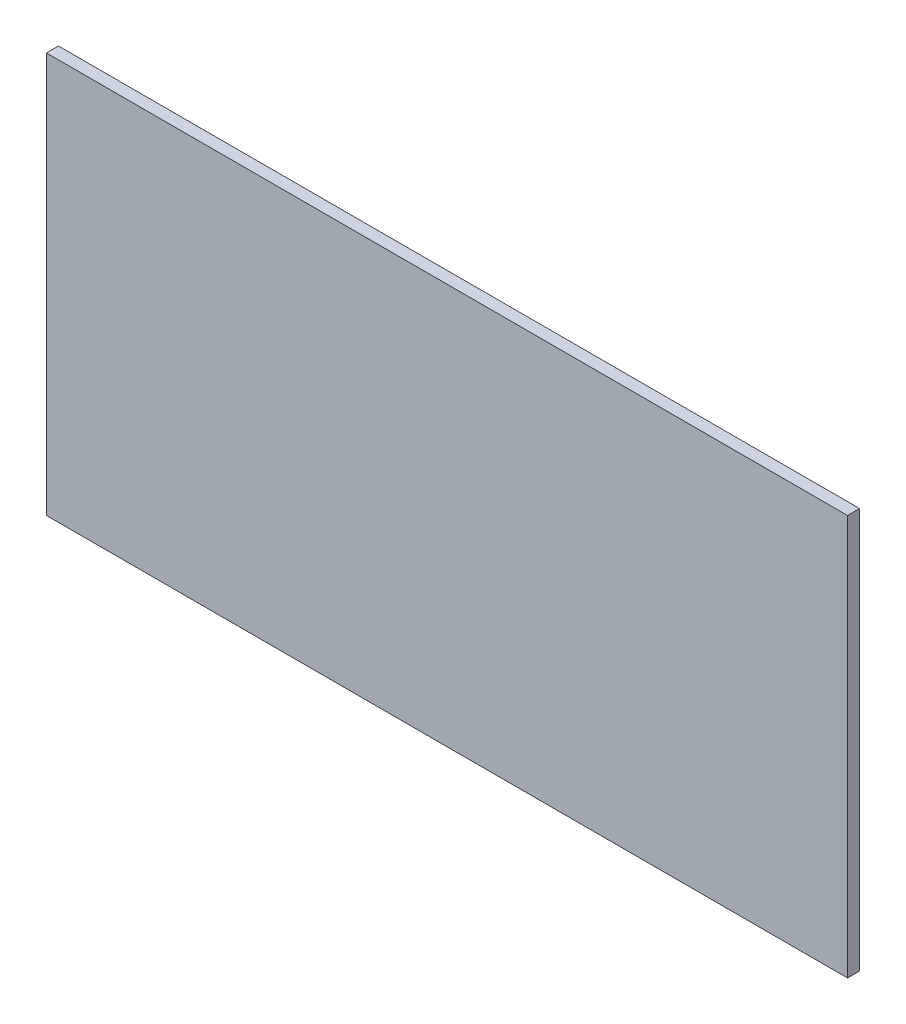
ISO-10303-21;
HEADER;
FILE_DESCRIPTION(('STEP AP214'),'2;1');
FILE_NAME('part.step','',(''),(''),'','','');
FILE_SCHEMA(('AUTOMOTIVE_DESIGN { 1 0 10303 214 1 1 1 1 }'));
ENDSEC;
DATA;
#1=APPLICATION_CONTEXT('core data for automotive mechanical design processes');
#2=APPLICATION_PROTOCOL_DEFINITION('international standard','automotive_design',2000,#1);
#3=PRODUCT_CONTEXT('',#1,'mechanical');
#4=PRODUCT('Part','Part','',(#3));
#5=PRODUCT_RELATED_PRODUCT_CATEGORY('part','',(#4));
#6=PRODUCT_DEFINITION_FORMATION('','',#4);
#7=PRODUCT_DEFINITION_CONTEXT('part definition',#1,'design');
#8=PRODUCT_DEFINITION('design','',#6,#7);
#9=PRODUCT_DEFINITION_SHAPE('','',#8);
#10=(LENGTH_UNIT() NAMED_UNIT(*) SI_UNIT(.MILLI.,.METRE.));
#11=(NAMED_UNIT(*) PLANE_ANGLE_UNIT() SI_UNIT($,.RADIAN.));
#12=(NAMED_UNIT(*) SI_UNIT($,.STERADIAN.) SOLID_ANGLE_UNIT());
#13=UNCERTAINTY_MEASURE_WITH_UNIT(LENGTH_MEASURE(1.E-05),#10,'distance_accuracy_value','');
#14=(GEOMETRIC_REPRESENTATION_CONTEXT(3) GLOBAL_UNCERTAINTY_ASSIGNED_CONTEXT((#13)) GLOBAL_UNIT_ASSIGNED_CONTEXT((#10,
#11,#12)) REPRESENTATION_CONTEXT('',''));
#15=CARTESIAN_POINT('',(0.,0.,0.));
#16=DIRECTION('',(0.,0.,1.));
#17=DIRECTION('',(1.,0.,0.));
#18=AXIS2_PLACEMENT_3D('',#15,#16,#17);
#19=CARTESIAN_POINT('',(100.,-50.,3.));
#20=DIRECTION('',(-1.,0.,0.));
#21=DIRECTION('',(0.,0.,1.));
#22=AXIS2_PLACEMENT_3D('',#19,#20,#21);
#23=PLANE('',#22);
#24=DIRECTION('',(0.,1.,0.));
#25=VECTOR('',#24,1.);
#26=CARTESIAN_POINT('',(100.,-50.,0.));
#27=LINE('',#26,#25);
#28=CARTESIAN_POINT('',(100.,-50.,0.));
#29=VERTEX_POINT('',#28);
#30=CARTESIAN_POINT('',(100.,50.,0.));
#31=VERTEX_POINT('',#30);
#32=EDGE_CURVE('E96',#29,#31,#27,.T.);
#33=ORIENTED_EDGE('',*,*,#32,.T.);
#34=DIRECTION('',(0.,0.,-1.));
#35=VECTOR('',#34,1.);
#36=CARTESIAN_POINT('',(100.,50.,3.));
#37=LINE('',#36,#35);
#38=CARTESIAN_POINT('',(100.,50.,3.));
#39=VERTEX_POINT('',#38);
#40=EDGE_CURVE('E11',#39,#31,#37,.T.);
#41=ORIENTED_EDGE('',*,*,#40,.F.);
#42=DIRECTION('',(0.,1.,0.));
#43=VECTOR('',#42,1.);
#44=CARTESIAN_POINT('',(100.,-50.,3.));
#45=LINE('',#44,#43);
#46=CARTESIAN_POINT('',(100.,-50.,3.));
#47=VERTEX_POINT('',#46);
#48=EDGE_CURVE('E84',#47,#39,#45,.T.);
#49=ORIENTED_EDGE('',*,*,#48,.F.);
#50=DIRECTION('',(0.,0.,-1.));
#51=VECTOR('',#50,1.);
#52=CARTESIAN_POINT('',(100.,-50.,3.));
#53=LINE('',#52,#51);
#54=EDGE_CURVE('E92',#47,#29,#53,.T.);
#55=ORIENTED_EDGE('',*,*,#54,.T.);
#56=EDGE_LOOP('',(#33,#41,#49,#55));
#57=FACE_BOUND('',#56,.T.);
#58=ADVANCED_FACE('F33',(#57),#23,.F.);
#59=CARTESIAN_POINT('',(-100.,50.,3.));
#60=DIRECTION('',(0.,-1.,0.));
#61=DIRECTION('',(0.,0.,-1.));
#62=AXIS2_PLACEMENT_3D('',#59,#60,#61);
#63=PLANE('',#62);
#64=DIRECTION('',(-1.,0.,0.));
#65=VECTOR('',#64,1.);
#66=CARTESIAN_POINT('',(-100.,50.,0.));
#67=LINE('',#66,#65);
#68=CARTESIAN_POINT('',(-100.,50.,0.));
#69=VERTEX_POINT('',#68);
#70=EDGE_CURVE('E88',#31,#69,#67,.T.);
#71=ORIENTED_EDGE('',*,*,#70,.T.);
#72=DIRECTION('',(0.,0.,-1.));
#73=VECTOR('',#72,1.);
#74=CARTESIAN_POINT('',(-100.,50.,3.));
#75=LINE('',#74,#73);
#76=CARTESIAN_POINT('',(-100.,50.,3.));
#77=VERTEX_POINT('',#76);
#78=EDGE_CURVE('E41',#77,#69,#75,.T.);
#79=ORIENTED_EDGE('',*,*,#78,.F.);
#80=DIRECTION('',(-1.,0.,0.));
#81=VECTOR('',#80,1.);
#82=CARTESIAN_POINT('',(-100.,50.,3.));
#83=LINE('',#82,#81);
#84=EDGE_CURVE('E79',#39,#77,#83,.T.);
#85=ORIENTED_EDGE('',*,*,#84,.F.);
#86=ORIENTED_EDGE('',*,*,#40,.T.);
#87=EDGE_LOOP('',(#71,#79,#85,#86));
#88=FACE_BOUND('',#87,.T.);
#89=ADVANCED_FACE('F87',(#88),#63,.F.);
#90=CARTESIAN_POINT('',(-100.,-50.,3.));
#91=DIRECTION('',(1.,0.,0.));
#92=DIRECTION('',(0.,0.,-1.));
#93=AXIS2_PLACEMENT_3D('',#90,#91,#92);
#94=PLANE('',#93);
#95=DIRECTION('',(0.,-1.,0.));
#96=VECTOR('',#95,1.);
#97=CARTESIAN_POINT('',(-100.,-50.,0.));
#98=LINE('',#97,#96);
#99=CARTESIAN_POINT('',(-100.,-50.,0.));
#100=VERTEX_POINT('',#99);
#101=EDGE_CURVE('E66',#69,#100,#98,.T.);
#102=ORIENTED_EDGE('',*,*,#101,.T.);
#103=DIRECTION('',(0.,0.,-1.));
#104=VECTOR('',#103,1.);
#105=CARTESIAN_POINT('',(-100.,-50.,3.));
#106=LINE('',#105,#104);
#107=CARTESIAN_POINT('',(-100.,-50.,3.));
#108=VERTEX_POINT('',#107);
#109=EDGE_CURVE('E89',#108,#100,#106,.T.);
#110=ORIENTED_EDGE('',*,*,#109,.F.);
#111=DIRECTION('',(0.,-1.,0.));
#112=VECTOR('',#111,1.);
#113=CARTESIAN_POINT('',(-100.,-50.,3.));
#114=LINE('',#113,#112);
#115=EDGE_CURVE('E82',#77,#108,#114,.T.);
#116=ORIENTED_EDGE('',*,*,#115,.F.);
#117=ORIENTED_EDGE('',*,*,#78,.T.);
#118=EDGE_LOOP('',(#102,#110,#116,#117));
#119=FACE_BOUND('',#118,.T.);
#120=ADVANCED_FACE('F90',(#119),#94,.F.);
#121=CARTESIAN_POINT('',(-100.,-50.,3.));
#122=DIRECTION('',(0.,1.,0.));
#123=DIRECTION('',(0.,0.,1.));
#124=AXIS2_PLACEMENT_3D('',#121,#122,#123);
#125=PLANE('',#124);
#126=DIRECTION('',(1.,0.,0.));
#127=VECTOR('',#126,1.);
#128=CARTESIAN_POINT('',(-100.,-50.,0.));
#129=LINE('',#128,#127);
#130=EDGE_CURVE('E72',#100,#29,#129,.T.);
#131=ORIENTED_EDGE('',*,*,#130,.T.);
#132=ORIENTED_EDGE('',*,*,#54,.F.);
#133=DIRECTION('',(1.,0.,0.));
#134=VECTOR('',#133,1.);
#135=CARTESIAN_POINT('',(-100.,-50.,3.));
#136=LINE('',#135,#134);
#137=EDGE_CURVE('E49',#108,#47,#136,.T.);
#138=ORIENTED_EDGE('',*,*,#137,.F.);
#139=ORIENTED_EDGE('',*,*,#109,.T.);
#140=EDGE_LOOP('',(#131,#132,#138,#139));
#141=FACE_BOUND('',#140,.T.);
#142=ADVANCED_FACE('F103',(#141),#125,.F.);
#143=CARTESIAN_POINT('',(0.,0.,3.));
#144=DIRECTION('',(0.,0.,-1.));
#145=DIRECTION('',(-1.,0.,0.));
#146=AXIS2_PLACEMENT_3D('',#143,#144,#145);
#147=PLANE('',#146);
#148=ORIENTED_EDGE('',*,*,#48,.T.);
#149=ORIENTED_EDGE('',*,*,#84,.T.);
#150=ORIENTED_EDGE('',*,*,#115,.T.);
#151=ORIENTED_EDGE('',*,*,#137,.T.);
#152=EDGE_LOOP('',(#148,#149,#150,#151));
#153=FACE_BOUND('',#152,.T.);
#154=ADVANCED_FACE('F80',(#153),#147,.F.);
#155=CARTESIAN_POINT('',(0.,0.,0.));
#156=DIRECTION('',(0.,0.,-1.));
#157=DIRECTION('',(-1.,0.,0.));
#158=AXIS2_PLACEMENT_3D('',#155,#156,#157);
#159=PLANE('',#158);
#160=ORIENTED_EDGE('',*,*,#32,.F.);
#161=ORIENTED_EDGE('',*,*,#130,.F.);
#162=ORIENTED_EDGE('',*,*,#101,.F.);
#163=ORIENTED_EDGE('',*,*,#70,.F.);
#164=EDGE_LOOP('',(#160,#161,#162,#163));
#165=FACE_BOUND('',#164,.T.);
#166=ADVANCED_FACE('F106',(#165),#159,.T.);
#167=CLOSED_SHELL('',(#58,#89,#120,#142,#154,#166));
#168=MANIFOLD_SOLID_BREP('B2',#167);
#169=ADVANCED_BREP_SHAPE_REPRESENTATION('',(#18,#168),#14);
#170=SHAPE_DEFINITION_REPRESENTATION(#9,#169);
ENDSEC;
END-ISO-10303-21;
